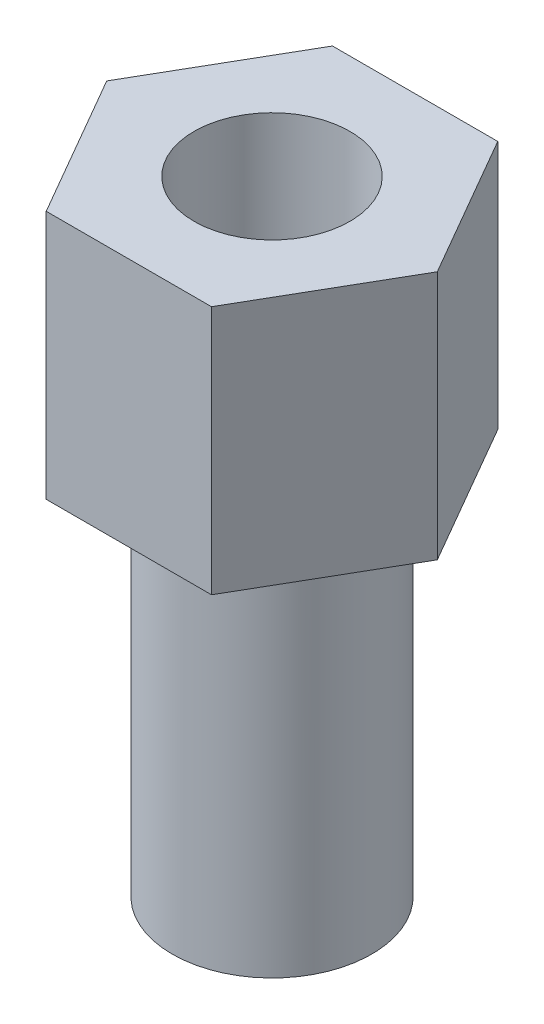
ISO-10303-21;
HEADER;
FILE_DESCRIPTION(('STEP AP214'),'2;1');
FILE_NAME('part.step','',(''),(''),'','','');
FILE_SCHEMA(('AUTOMOTIVE_DESIGN { 1 0 10303 214 1 1 1 1 }'));
ENDSEC;
DATA;
#1=APPLICATION_CONTEXT('core data for automotive mechanical design processes');
#2=APPLICATION_PROTOCOL_DEFINITION('international standard','automotive_design',2000,#1);
#3=PRODUCT_CONTEXT('',#1,'mechanical');
#4=PRODUCT('Part','Part','',(#3));
#5=PRODUCT_RELATED_PRODUCT_CATEGORY('part','',(#4));
#6=PRODUCT_DEFINITION_FORMATION('','',#4);
#7=PRODUCT_DEFINITION_CONTEXT('part definition',#1,'design');
#8=PRODUCT_DEFINITION('design','',#6,#7);
#9=PRODUCT_DEFINITION_SHAPE('','',#8);
#10=(LENGTH_UNIT() NAMED_UNIT(*) SI_UNIT(.MILLI.,.METRE.));
#11=(NAMED_UNIT(*) PLANE_ANGLE_UNIT() SI_UNIT($,.RADIAN.));
#12=(NAMED_UNIT(*) SI_UNIT($,.STERADIAN.) SOLID_ANGLE_UNIT());
#13=UNCERTAINTY_MEASURE_WITH_UNIT(LENGTH_MEASURE(1.E-05),#10,'distance_accuracy_value','');
#14=(GEOMETRIC_REPRESENTATION_CONTEXT(3) GLOBAL_UNCERTAINTY_ASSIGNED_CONTEXT((#13)) GLOBAL_UNIT_ASSIGNED_CONTEXT((#10,
#11,#12)) REPRESENTATION_CONTEXT('',''));
#15=CARTESIAN_POINT('',(0.,0.,0.));
#16=DIRECTION('',(0.,0.,1.));
#17=DIRECTION('',(1.,0.,0.));
#18=AXIS2_PLACEMENT_3D('',#15,#16,#17);
#19=CARTESIAN_POINT('',(-1.325,4.,2.29496732002876));
#20=DIRECTION('',(0.,0.,-1.));
#21=DIRECTION('',(-1.,0.,0.));
#22=AXIS2_PLACEMENT_3D('',#19,#20,#21);
#23=PLANE('',#22);
#24=DIRECTION('',(1.,0.,0.));
#25=VECTOR('',#24,1.);
#26=CARTESIAN_POINT('',(-1.325,0.,2.29496732002876));
#27=LINE('',#26,#25);
#28=CARTESIAN_POINT('',(-1.325,0.,2.29496732002876));
#29=VERTEX_POINT('',#28);
#30=CARTESIAN_POINT('',(1.325,0.,2.29496732002876));
#31=VERTEX_POINT('',#30);
#32=EDGE_CURVE('E124',#29,#31,#27,.T.);
#33=ORIENTED_EDGE('',*,*,#32,.T.);
#34=DIRECTION('',(0.,-1.,0.));
#35=VECTOR('',#34,1.);
#36=CARTESIAN_POINT('',(1.325,4.,2.29496732002876));
#37=LINE('',#36,#35);
#38=CARTESIAN_POINT('',(1.325,4.,2.29496732002876));
#39=VERTEX_POINT('',#38);
#40=EDGE_CURVE('E47',#39,#31,#37,.T.);
#41=ORIENTED_EDGE('',*,*,#40,.F.);
#42=DIRECTION('',(1.,0.,0.));
#43=VECTOR('',#42,1.);
#44=CARTESIAN_POINT('',(-1.325,4.,2.29496732002876));
#45=LINE('',#44,#43);
#46=CARTESIAN_POINT('',(-1.325,4.,2.29496732002876));
#47=VERTEX_POINT('',#46);
#48=EDGE_CURVE('E135',#47,#39,#45,.T.);
#49=ORIENTED_EDGE('',*,*,#48,.F.);
#50=DIRECTION('',(0.,-1.,0.));
#51=VECTOR('',#50,1.);
#52=CARTESIAN_POINT('',(-1.325,4.,2.29496732002876));
#53=LINE('',#52,#51);
#54=EDGE_CURVE('E120',#47,#29,#53,.T.);
#55=ORIENTED_EDGE('',*,*,#54,.T.);
#56=EDGE_LOOP('',(#33,#41,#49,#55));
#57=FACE_BOUND('',#56,.T.);
#58=ADVANCED_FACE('F39',(#57),#23,.F.);
#59=CARTESIAN_POINT('',(1.325,4.,2.29496732002876));
#60=DIRECTION('',(-0.866025403784439,0.,-0.5));
#61=DIRECTION('',(-0.5,0.,0.866025403784439));
#62=AXIS2_PLACEMENT_3D('',#59,#60,#61);
#63=PLANE('',#62);
#64=DIRECTION('',(0.5,0.,-0.866025403784439));
#65=VECTOR('',#64,1.);
#66=CARTESIAN_POINT('',(1.325,0.,2.29496732002876));
#67=LINE('',#66,#65);
#68=CARTESIAN_POINT('',(2.65,0.,0.));
#69=VERTEX_POINT('',#68);
#70=EDGE_CURVE('E127',#31,#69,#67,.T.);
#71=ORIENTED_EDGE('',*,*,#70,.T.);
#72=DIRECTION('',(0.,-1.,0.));
#73=VECTOR('',#72,1.);
#74=CARTESIAN_POINT('',(2.65,4.,0.));
#75=LINE('',#74,#73);
#76=CARTESIAN_POINT('',(2.65,4.,0.));
#77=VERTEX_POINT('',#76);
#78=EDGE_CURVE('E139',#77,#69,#75,.T.);
#79=ORIENTED_EDGE('',*,*,#78,.F.);
#80=DIRECTION('',(0.5,0.,-0.866025403784439));
#81=VECTOR('',#80,1.);
#82=CARTESIAN_POINT('',(1.325,4.,2.29496732002876));
#83=LINE('',#82,#81);
#84=EDGE_CURVE('E93',#39,#77,#83,.T.);
#85=ORIENTED_EDGE('',*,*,#84,.F.);
#86=ORIENTED_EDGE('',*,*,#40,.T.);
#87=EDGE_LOOP('',(#71,#79,#85,#86));
#88=FACE_BOUND('',#87,.T.);
#89=ADVANCED_FACE('F142',(#88),#63,.F.);
#90=CARTESIAN_POINT('',(2.65,4.,0.));
#91=DIRECTION('',(-0.866025403784439,0.,0.5));
#92=DIRECTION('',(0.5,0.,0.866025403784439));
#93=AXIS2_PLACEMENT_3D('',#90,#91,#92);
#94=PLANE('',#93);
#95=DIRECTION('',(-0.5,0.,-0.866025403784439));
#96=VECTOR('',#95,1.);
#97=CARTESIAN_POINT('',(2.65,0.,0.));
#98=LINE('',#97,#96);
#99=CARTESIAN_POINT('',(1.325,0.,-2.29496732002876));
#100=VERTEX_POINT('',#99);
#101=EDGE_CURVE('E130',#69,#100,#98,.T.);
#102=ORIENTED_EDGE('',*,*,#101,.T.);
#103=DIRECTION('',(0.,-1.,0.));
#104=VECTOR('',#103,1.);
#105=CARTESIAN_POINT('',(1.325,4.,-2.29496732002876));
#106=LINE('',#105,#104);
#107=CARTESIAN_POINT('',(1.325,4.,-2.29496732002876));
#108=VERTEX_POINT('',#107);
#109=EDGE_CURVE('E115',#108,#100,#106,.T.);
#110=ORIENTED_EDGE('',*,*,#109,.F.);
#111=DIRECTION('',(-0.5,0.,-0.866025403784439));
#112=VECTOR('',#111,1.);
#113=CARTESIAN_POINT('',(2.65,4.,0.));
#114=LINE('',#113,#112);
#115=EDGE_CURVE('E106',#77,#108,#114,.T.);
#116=ORIENTED_EDGE('',*,*,#115,.F.);
#117=ORIENTED_EDGE('',*,*,#78,.T.);
#118=EDGE_LOOP('',(#102,#110,#116,#117));
#119=FACE_BOUND('',#118,.T.);
#120=ADVANCED_FACE('F150',(#119),#94,.F.);
#121=CARTESIAN_POINT('',(1.325,4.,-2.29496732002876));
#122=DIRECTION('',(0.,0.,1.));
#123=DIRECTION('',(1.,0.,0.));
#124=AXIS2_PLACEMENT_3D('',#121,#122,#123);
#125=PLANE('',#124);
#126=DIRECTION('',(-1.,0.,0.));
#127=VECTOR('',#126,1.);
#128=CARTESIAN_POINT('',(1.325,0.,-2.29496732002876));
#129=LINE('',#128,#127);
#130=CARTESIAN_POINT('',(-1.325,0.,-2.29496732002876));
#131=VERTEX_POINT('',#130);
#132=EDGE_CURVE('E114',#100,#131,#129,.T.);
#133=ORIENTED_EDGE('',*,*,#132,.T.);
#134=DIRECTION('',(0.,-1.,0.));
#135=VECTOR('',#134,1.);
#136=CARTESIAN_POINT('',(-1.325,4.,-2.29496732002876));
#137=LINE('',#136,#135);
#138=CARTESIAN_POINT('',(-1.325,4.,-2.29496732002876));
#139=VERTEX_POINT('',#138);
#140=EDGE_CURVE('E111',#139,#131,#137,.T.);
#141=ORIENTED_EDGE('',*,*,#140,.F.);
#142=DIRECTION('',(-1.,0.,0.));
#143=VECTOR('',#142,1.);
#144=CARTESIAN_POINT('',(1.325,4.,-2.29496732002876));
#145=LINE('',#144,#143);
#146=EDGE_CURVE('E100',#108,#139,#145,.T.);
#147=ORIENTED_EDGE('',*,*,#146,.F.);
#148=ORIENTED_EDGE('',*,*,#109,.T.);
#149=EDGE_LOOP('',(#133,#141,#147,#148));
#150=FACE_BOUND('',#149,.T.);
#151=ADVANCED_FACE('F112',(#150),#125,.F.);
#152=CARTESIAN_POINT('',(-1.325,4.,-2.29496732002876));
#153=DIRECTION('',(0.866025403784439,0.,0.5));
#154=DIRECTION('',(0.5,0.,-0.866025403784439));
#155=AXIS2_PLACEMENT_3D('',#152,#153,#154);
#156=PLANE('',#155);
#157=DIRECTION('',(-0.5,0.,0.866025403784439));
#158=VECTOR('',#157,1.);
#159=CARTESIAN_POINT('',(-1.325,0.,-2.29496732002876));
#160=LINE('',#159,#158);
#161=CARTESIAN_POINT('',(-2.65,0.,0.));
#162=VERTEX_POINT('',#161);
#163=EDGE_CURVE('E78',#131,#162,#160,.T.);
#164=ORIENTED_EDGE('',*,*,#163,.T.);
#165=DIRECTION('',(0.,-1.,0.));
#166=VECTOR('',#165,1.);
#167=CARTESIAN_POINT('',(-2.65,4.,0.));
#168=LINE('',#167,#166);
#169=CARTESIAN_POINT('',(-2.65,4.,0.));
#170=VERTEX_POINT('',#169);
#171=EDGE_CURVE('E116',#170,#162,#168,.T.);
#172=ORIENTED_EDGE('',*,*,#171,.F.);
#173=DIRECTION('',(-0.5,0.,0.866025403784439));
#174=VECTOR('',#173,1.);
#175=CARTESIAN_POINT('',(-1.325,4.,-2.29496732002876));
#176=LINE('',#175,#174);
#177=EDGE_CURVE('E104',#139,#170,#176,.T.);
#178=ORIENTED_EDGE('',*,*,#177,.F.);
#179=ORIENTED_EDGE('',*,*,#140,.T.);
#180=EDGE_LOOP('',(#164,#172,#178,#179));
#181=FACE_BOUND('',#180,.T.);
#182=ADVANCED_FACE('F118',(#181),#156,.F.);
#183=CARTESIAN_POINT('',(-2.65,4.,0.));
#184=DIRECTION('',(0.866025403784439,0.,-0.5));
#185=DIRECTION('',(-0.5,0.,-0.866025403784439));
#186=AXIS2_PLACEMENT_3D('',#183,#184,#185);
#187=PLANE('',#186);
#188=DIRECTION('',(0.5,0.,0.866025403784439));
#189=VECTOR('',#188,1.);
#190=CARTESIAN_POINT('',(-2.65,0.,0.));
#191=LINE('',#190,#189);
#192=EDGE_CURVE('E84',#162,#29,#191,.T.);
#193=ORIENTED_EDGE('',*,*,#192,.T.);
#194=ORIENTED_EDGE('',*,*,#54,.F.);
#195=DIRECTION('',(0.5,0.,0.866025403784439));
#196=VECTOR('',#195,1.);
#197=CARTESIAN_POINT('',(-2.65,4.,0.));
#198=LINE('',#197,#196);
#199=EDGE_CURVE('E55',#170,#47,#198,.T.);
#200=ORIENTED_EDGE('',*,*,#199,.F.);
#201=ORIENTED_EDGE('',*,*,#171,.T.);
#202=EDGE_LOOP('',(#193,#194,#200,#201));
#203=FACE_BOUND('',#202,.T.);
#204=ADVANCED_FACE('F173',(#203),#187,.F.);
#205=CARTESIAN_POINT('',(0.,4.,0.));
#206=DIRECTION('',(0.,1.,0.));
#207=DIRECTION('',(0.,0.,1.));
#208=AXIS2_PLACEMENT_3D('',#205,#206,#207);
#209=PLANE('',#208);
#210=CARTESIAN_POINT('',(0.,4.,0.));
#211=DIRECTION('',(0.,1.,0.));
#212=DIRECTION('',(0.,0.,1.));
#213=AXIS2_PLACEMENT_3D('',#210,#211,#212);
#214=CIRCLE('',#213,1.25);
#215=CARTESIAN_POINT('',(0.,4.,1.25));
#216=VERTEX_POINT('',#215);
#217=EDGE_CURVE('E157',#216,#216,#214,.T.);
#218=ORIENTED_EDGE('',*,*,#217,.F.);
#219=EDGE_LOOP('',(#218));
#220=FACE_BOUND('',#219,.T.);
#221=ORIENTED_EDGE('',*,*,#48,.T.);
#222=ORIENTED_EDGE('',*,*,#84,.T.);
#223=ORIENTED_EDGE('',*,*,#115,.T.);
#224=ORIENTED_EDGE('',*,*,#146,.T.);
#225=ORIENTED_EDGE('',*,*,#177,.T.);
#226=ORIENTED_EDGE('',*,*,#199,.T.);
#227=EDGE_LOOP('',(#221,#222,#223,#224,#225,#226));
#228=FACE_BOUND('',#227,.T.);
#229=ADVANCED_FACE('F102',(#220,#228),#209,.T.);
#230=CARTESIAN_POINT('',(0.,0.,0.));
#231=DIRECTION('',(0.,1.,0.));
#232=DIRECTION('',(0.,0.,1.));
#233=AXIS2_PLACEMENT_3D('',#230,#231,#232);
#234=PLANE('',#233);
#235=CARTESIAN_POINT('',(0.,0.,0.));
#236=DIRECTION('',(0.,1.,0.));
#237=DIRECTION('',(0.,0.,1.));
#238=AXIS2_PLACEMENT_3D('',#235,#236,#237);
#239=CIRCLE('',#238,1.6);
#240=CARTESIAN_POINT('',(0.,0.,1.6));
#241=VERTEX_POINT('',#240);
#242=EDGE_CURVE('E11',#241,#241,#239,.F.);
#243=ORIENTED_EDGE('',*,*,#242,.F.);
#244=EDGE_LOOP('',(#243));
#245=FACE_BOUND('',#244,.T.);
#246=ORIENTED_EDGE('',*,*,#32,.F.);
#247=ORIENTED_EDGE('',*,*,#192,.F.);
#248=ORIENTED_EDGE('',*,*,#163,.F.);
#249=ORIENTED_EDGE('',*,*,#132,.F.);
#250=ORIENTED_EDGE('',*,*,#101,.F.);
#251=ORIENTED_EDGE('',*,*,#70,.F.);
#252=EDGE_LOOP('',(#246,#247,#248,#249,#250,#251));
#253=FACE_BOUND('',#252,.T.);
#254=ADVANCED_FACE('F147',(#245,#253),#234,.F.);
#255=CARTESIAN_POINT('',(0.,-6.,0.));
#256=DIRECTION('',(0.,1.,0.));
#257=DIRECTION('',(0.,0.,1.));
#258=AXIS2_PLACEMENT_3D('',#255,#256,#257);
#259=CYLINDRICAL_SURFACE('',#258,1.6);
#260=CARTESIAN_POINT('',(0.,-6.,0.));
#261=DIRECTION('',(0.,-1.,0.));
#262=DIRECTION('',(0.,0.,-1.));
#263=AXIS2_PLACEMENT_3D('',#260,#261,#262);
#264=CIRCLE('',#263,1.6);
#265=CARTESIAN_POINT('',(0.,-6.,-1.6));
#266=VERTEX_POINT('',#265);
#267=EDGE_CURVE('E128',#266,#266,#264,.T.);
#268=ORIENTED_EDGE('',*,*,#267,.F.);
#269=EDGE_LOOP('',(#268));
#270=FACE_BOUND('',#269,.T.);
#271=ORIENTED_EDGE('',*,*,#242,.T.);
#272=EDGE_LOOP('',(#271));
#273=FACE_BOUND('',#272,.T.);
#274=ADVANCED_FACE('F179',(#270,#273),#259,.T.);
#275=CARTESIAN_POINT('',(0.,-6.,0.));
#276=DIRECTION('',(0.,-1.,0.));
#277=DIRECTION('',(0.,0.,-1.));
#278=AXIS2_PLACEMENT_3D('',#275,#276,#277);
#279=PLANE('',#278);
#280=ORIENTED_EDGE('',*,*,#267,.T.);
#281=EDGE_LOOP('',(#280));
#282=FACE_BOUND('',#281,.T.);
#283=ADVANCED_FACE('F168',(#282),#279,.T.);
#284=CARTESIAN_POINT('',(0.,-1.,0.));
#285=DIRECTION('',(0.,1.,0.));
#286=DIRECTION('',(0.,0.,1.));
#287=AXIS2_PLACEMENT_3D('',#284,#285,#286);
#288=CYLINDRICAL_SURFACE('',#287,1.25);
#289=CARTESIAN_POINT('',(0.,-1.,0.));
#290=DIRECTION('',(0.,1.,0.));
#291=DIRECTION('',(0.,0.,1.));
#292=AXIS2_PLACEMENT_3D('',#289,#290,#291);
#293=CIRCLE('',#292,1.25);
#294=CARTESIAN_POINT('',(0.,-1.,1.25));
#295=VERTEX_POINT('',#294);
#296=EDGE_CURVE('E156',#295,#295,#293,.T.);
#297=ORIENTED_EDGE('',*,*,#296,.F.);
#298=EDGE_LOOP('',(#297));
#299=FACE_BOUND('',#298,.T.);
#300=ORIENTED_EDGE('',*,*,#217,.T.);
#301=EDGE_LOOP('',(#300));
#302=FACE_BOUND('',#301,.T.);
#303=ADVANCED_FACE('F165',(#299,#302),#288,.F.);
#304=CARTESIAN_POINT('',(0.,-1.,0.));
#305=DIRECTION('',(0.,1.,0.));
#306=DIRECTION('',(0.,0.,1.));
#307=AXIS2_PLACEMENT_3D('',#304,#305,#306);
#308=PLANE('',#307);
#309=ORIENTED_EDGE('',*,*,#296,.T.);
#310=EDGE_LOOP('',(#309));
#311=FACE_BOUND('',#310,.T.);
#312=ADVANCED_FACE('F163',(#311),#308,.T.);
#313=CLOSED_SHELL('',(#58,#89,#120,#151,#182,#204,#229,#254,#274,#283,#303,#312));
#314=MANIFOLD_SOLID_BREP('B2',#313);
#315=ADVANCED_BREP_SHAPE_REPRESENTATION('',(#18,#314),#14);
#316=SHAPE_DEFINITION_REPRESENTATION(#9,#315);
ENDSEC;
END-ISO-10303-21;
